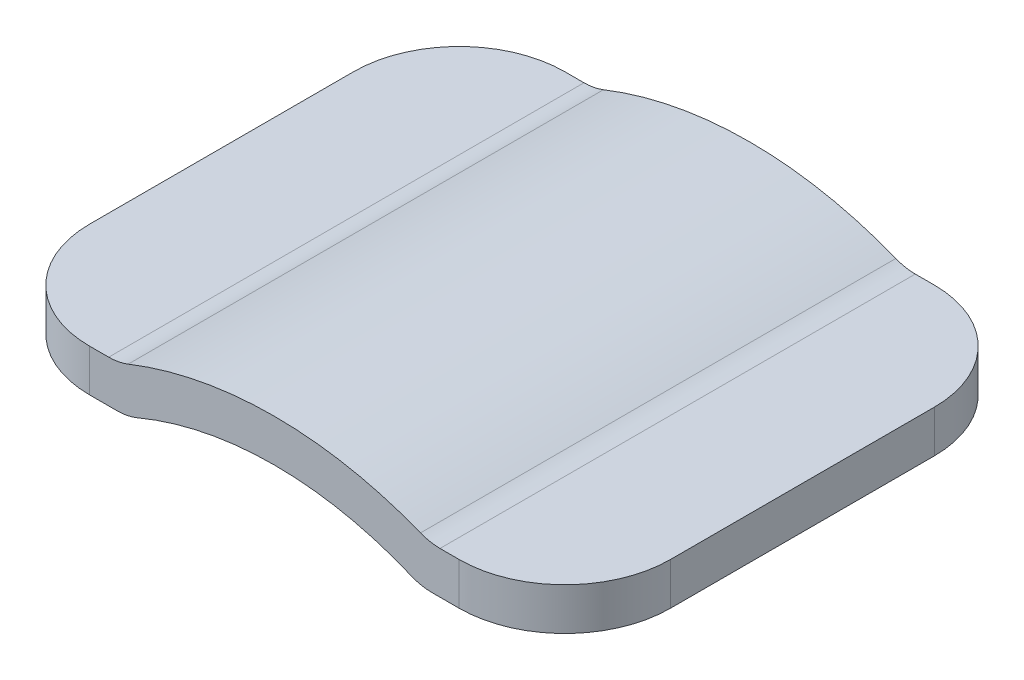
ISO-10303-21;
HEADER;
FILE_DESCRIPTION(('STEP AP214'),'2;1');
FILE_NAME('part.step','',(''),(''),'','','');
FILE_SCHEMA(('AUTOMOTIVE_DESIGN { 1 0 10303 214 1 1 1 1 }'));
ENDSEC;
DATA;
#1=APPLICATION_CONTEXT('core data for automotive mechanical design processes');
#2=APPLICATION_PROTOCOL_DEFINITION('international standard','automotive_design',2000,#1);
#3=PRODUCT_CONTEXT('',#1,'mechanical');
#4=PRODUCT('Part','Part','',(#3));
#5=PRODUCT_RELATED_PRODUCT_CATEGORY('part','',(#4));
#6=PRODUCT_DEFINITION_FORMATION('','',#4);
#7=PRODUCT_DEFINITION_CONTEXT('part definition',#1,'design');
#8=PRODUCT_DEFINITION('design','',#6,#7);
#9=PRODUCT_DEFINITION_SHAPE('','',#8);
#10=(LENGTH_UNIT() NAMED_UNIT(*) SI_UNIT(.MILLI.,.METRE.));
#11=(NAMED_UNIT(*) PLANE_ANGLE_UNIT() SI_UNIT($,.RADIAN.));
#12=(NAMED_UNIT(*) SI_UNIT($,.STERADIAN.) SOLID_ANGLE_UNIT());
#13=UNCERTAINTY_MEASURE_WITH_UNIT(LENGTH_MEASURE(1.E-05),#10,'distance_accuracy_value','');
#14=(GEOMETRIC_REPRESENTATION_CONTEXT(3) GLOBAL_UNCERTAINTY_ASSIGNED_CONTEXT((#13)) GLOBAL_UNIT_ASSIGNED_CONTEXT((#10,
#11,#12)) REPRESENTATION_CONTEXT('',''));
#15=CARTESIAN_POINT('',(0.,0.,0.));
#16=DIRECTION('',(0.,0.,1.));
#17=DIRECTION('',(1.,0.,0.));
#18=AXIS2_PLACEMENT_3D('',#15,#16,#17);
#19=CARTESIAN_POINT('',(-1100.,-120.,900.));
#20=DIRECTION('',(0.,1.,0.));
#21=DIRECTION('',(0.,0.,1.));
#22=AXIS2_PLACEMENT_3D('',#19,#20,#21);
#23=PLANE('',#22);
#24=CARTESIAN_POINT('',(-700.,-120.,-500.));
#25=DIRECTION('',(0.,1.,0.));
#26=DIRECTION('',(-1.,0.,0.));
#27=AXIS2_PLACEMENT_3D('',#24,#25,#26);
#28=CIRCLE('',#27,400.);
#29=CARTESIAN_POINT('',(-700.,-120.,-900.));
#30=VERTEX_POINT('',#29);
#31=CARTESIAN_POINT('',(-1100.,-120.,-500.));
#32=VERTEX_POINT('',#31);
#33=EDGE_CURVE('E149',#30,#32,#28,.T.);
#34=ORIENTED_EDGE('',*,*,#33,.F.);
#35=DIRECTION('',(1.,0.,0.));
#36=VECTOR('',#35,1.);
#37=CARTESIAN_POINT('',(-1100.,-120.,-900.));
#38=LINE('',#37,#36);
#39=CARTESIAN_POINT('',(-595.986577030053,-120.,-900.));
#40=VERTEX_POINT('',#39);
#41=EDGE_CURVE('E228',#30,#40,#38,.T.);
#42=ORIENTED_EDGE('',*,*,#41,.T.);
#43=DIRECTION('',(0.,0.,-1.));
#44=VECTOR('',#43,1.);
#45=CARTESIAN_POINT('',(-595.986577030053,-120.,900.));
#46=LINE('',#45,#44);
#47=CARTESIAN_POINT('',(-595.986577030053,-120.,900.));
#48=VERTEX_POINT('',#47);
#49=EDGE_CURVE('E12',#48,#40,#46,.T.);
#50=ORIENTED_EDGE('',*,*,#49,.F.);
#51=DIRECTION('',(1.,0.,0.));
#52=VECTOR('',#51,1.);
#53=CARTESIAN_POINT('',(-1100.,-120.,900.));
#54=LINE('',#53,#52);
#55=CARTESIAN_POINT('',(-700.,-120.,900.));
#56=VERTEX_POINT('',#55);
#57=EDGE_CURVE('E244',#56,#48,#54,.T.);
#58=ORIENTED_EDGE('',*,*,#57,.F.);
#59=CARTESIAN_POINT('',(-700.,-120.,500.));
#60=DIRECTION('',(0.,1.,0.));
#61=DIRECTION('',(-1.,0.,0.));
#62=AXIS2_PLACEMENT_3D('',#59,#60,#61);
#63=CIRCLE('',#62,400.);
#64=CARTESIAN_POINT('',(-1100.,-120.,500.));
#65=VERTEX_POINT('',#64);
#66=EDGE_CURVE('E60',#65,#56,#63,.T.);
#67=ORIENTED_EDGE('',*,*,#66,.F.);
#68=DIRECTION('',(0.,0.,-1.));
#69=VECTOR('',#68,1.);
#70=CARTESIAN_POINT('',(-1100.,-120.,900.));
#71=LINE('',#70,#69);
#72=EDGE_CURVE('E166',#65,#32,#71,.T.);
#73=ORIENTED_EDGE('',*,*,#72,.T.);
#74=EDGE_LOOP('',(#34,#42,#50,#58,#67,#73));
#75=FACE_BOUND('',#74,.T.);
#76=ADVANCED_FACE('F38',(#75),#23,.F.);
#77=CARTESIAN_POINT('',(1100.,-120.,900.));
#78=DIRECTION('',(0.,1.,0.));
#79=DIRECTION('',(-1.,0.,0.));
#80=AXIS2_PLACEMENT_3D('',#77,#78,#79);
#81=PLANE('',#80);
#82=CARTESIAN_POINT('',(700.,-120.,-500.));
#83=DIRECTION('',(0.,1.,0.));
#84=DIRECTION('',(1.,0.,0.));
#85=AXIS2_PLACEMENT_3D('',#82,#83,#84);
#86=CIRCLE('',#85,400.);
#87=CARTESIAN_POINT('',(1100.,-120.,-500.));
#88=VERTEX_POINT('',#87);
#89=CARTESIAN_POINT('',(700.,-120.,-900.));
#90=VERTEX_POINT('',#89);
#91=EDGE_CURVE('E170',#88,#90,#86,.T.);
#92=ORIENTED_EDGE('',*,*,#91,.F.);
#93=DIRECTION('',(0.,0.,-1.));
#94=VECTOR('',#93,1.);
#95=CARTESIAN_POINT('',(1100.,-120.,900.));
#96=LINE('',#95,#94);
#97=CARTESIAN_POINT('',(1100.,-120.,499.999999999999));
#98=VERTEX_POINT('',#97);
#99=EDGE_CURVE('E198',#98,#88,#96,.T.);
#100=ORIENTED_EDGE('',*,*,#99,.F.);
#101=CARTESIAN_POINT('',(700.,-120.,499.999999999999));
#102=DIRECTION('',(0.,1.,0.));
#103=DIRECTION('',(1.,0.,0.));
#104=AXIS2_PLACEMENT_3D('',#101,#102,#103);
#105=CIRCLE('',#104,400.);
#106=CARTESIAN_POINT('',(700.,-120.,899.999999999999));
#107=VERTEX_POINT('',#106);
#108=EDGE_CURVE('E312',#107,#98,#105,.T.);
#109=ORIENTED_EDGE('',*,*,#108,.F.);
#110=DIRECTION('',(1.,0.,0.));
#111=VECTOR('',#110,1.);
#112=CARTESIAN_POINT('',(1100.,-120.,900.));
#113=LINE('',#112,#111);
#114=CARTESIAN_POINT('',(595.986577030054,-120.,900.));
#115=VERTEX_POINT('',#114);
#116=EDGE_CURVE('E256',#115,#107,#113,.T.);
#117=ORIENTED_EDGE('',*,*,#116,.F.);
#118=DIRECTION('',(0.,0.,-1.));
#119=VECTOR('',#118,1.);
#120=CARTESIAN_POINT('',(595.986577030054,-120.,900.));
#121=LINE('',#120,#119);
#122=CARTESIAN_POINT('',(595.986577030054,-120.,-900.));
#123=VERTEX_POINT('',#122);
#124=EDGE_CURVE('E201',#115,#123,#121,.T.);
#125=ORIENTED_EDGE('',*,*,#124,.T.);
#126=DIRECTION('',(1.,0.,0.));
#127=VECTOR('',#126,1.);
#128=CARTESIAN_POINT('',(1100.,-120.,-900.));
#129=LINE('',#128,#127);
#130=EDGE_CURVE('E226',#123,#90,#129,.T.);
#131=ORIENTED_EDGE('',*,*,#130,.T.);
#132=EDGE_LOOP('',(#92,#100,#109,#117,#125,#131));
#133=FACE_BOUND('',#132,.T.);
#134=ADVANCED_FACE('F317',(#133),#81,.F.);
#135=CARTESIAN_POINT('',(1100.,-120.,900.));
#136=DIRECTION('',(-1.,0.,0.));
#137=DIRECTION('',(0.,0.,1.));
#138=AXIS2_PLACEMENT_3D('',#135,#136,#137);
#139=PLANE('',#138);
#140=ORIENTED_EDGE('',*,*,#99,.T.);
#141=DIRECTION('',(0.,1.,0.));
#142=VECTOR('',#141,1.);
#143=CARTESIAN_POINT('',(1100.,-120.,-500.));
#144=LINE('',#143,#142);
#145=CARTESIAN_POINT('',(1100.,39.9999999999998,-500.));
#146=VERTEX_POINT('',#145);
#147=EDGE_CURVE('E268',#88,#146,#144,.T.);
#148=ORIENTED_EDGE('',*,*,#147,.T.);
#149=DIRECTION('',(0.,0.,-1.));
#150=VECTOR('',#149,1.);
#151=CARTESIAN_POINT('',(1100.,40.0000000000002,900.));
#152=LINE('',#151,#150);
#153=CARTESIAN_POINT('',(1100.,39.9999999999998,499.999999999999));
#154=VERTEX_POINT('',#153);
#155=EDGE_CURVE('E195',#154,#146,#152,.T.);
#156=ORIENTED_EDGE('',*,*,#155,.F.);
#157=DIRECTION('',(0.,1.,0.));
#158=VECTOR('',#157,1.);
#159=CARTESIAN_POINT('',(1100.,-120.,499.999999999999));
#160=LINE('',#159,#158);
#161=EDGE_CURVE('E275',#98,#154,#160,.T.);
#162=ORIENTED_EDGE('',*,*,#161,.F.);
#163=EDGE_LOOP('',(#140,#148,#156,#162));
#164=FACE_BOUND('',#163,.T.);
#165=ADVANCED_FACE('F321',(#164),#139,.F.);
#166=CARTESIAN_POINT('',(1100.,40.0000000000002,900.));
#167=DIRECTION('',(0.,-1.,0.));
#168=DIRECTION('',(1.,0.,0.));
#169=AXIS2_PLACEMENT_3D('',#166,#167,#168);
#170=PLANE('',#169);
#171=CARTESIAN_POINT('',(700.,39.9999999999998,-500.));
#172=DIRECTION('',(0.,1.,0.));
#173=DIRECTION('',(1.,0.,0.));
#174=AXIS2_PLACEMENT_3D('',#171,#172,#173);
#175=CIRCLE('',#174,400.);
#176=CARTESIAN_POINT('',(700.,39.9999999999998,-900.));
#177=VERTEX_POINT('',#176);
#178=EDGE_CURVE('E159',#146,#177,#175,.T.);
#179=ORIENTED_EDGE('',*,*,#178,.T.);
#180=DIRECTION('',(-1.,0.,0.));
#181=VECTOR('',#180,1.);
#182=CARTESIAN_POINT('',(1100.,40.0000000000002,-900.));
#183=LINE('',#182,#181);
#184=CARTESIAN_POINT('',(627.375485654325,40.,-900.));
#185=VERTEX_POINT('',#184);
#186=EDGE_CURVE('E234',#177,#185,#183,.T.);
#187=ORIENTED_EDGE('',*,*,#186,.T.);
#188=DIRECTION('',(0.,0.,-1.));
#189=VECTOR('',#188,1.);
#190=CARTESIAN_POINT('',(627.375485654325,40.,900.));
#191=LINE('',#190,#189);
#192=CARTESIAN_POINT('',(627.375485654325,40.,900.));
#193=VERTEX_POINT('',#192);
#194=EDGE_CURVE('E192',#193,#185,#191,.T.);
#195=ORIENTED_EDGE('',*,*,#194,.F.);
#196=DIRECTION('',(-1.,0.,0.));
#197=VECTOR('',#196,1.);
#198=CARTESIAN_POINT('',(1100.,40.0000000000002,900.));
#199=LINE('',#198,#197);
#200=CARTESIAN_POINT('',(700.,40.0000000000001,900.));
#201=VERTEX_POINT('',#200);
#202=EDGE_CURVE('E259',#201,#193,#199,.T.);
#203=ORIENTED_EDGE('',*,*,#202,.F.);
#204=CARTESIAN_POINT('',(700.,39.9999999999998,499.999999999999));
#205=DIRECTION('',(0.,1.,0.));
#206=DIRECTION('',(1.,0.,0.));
#207=AXIS2_PLACEMENT_3D('',#204,#205,#206);
#208=CIRCLE('',#207,400.);
#209=EDGE_CURVE('E52',#201,#154,#208,.T.);
#210=ORIENTED_EDGE('',*,*,#209,.T.);
#211=ORIENTED_EDGE('',*,*,#155,.T.);
#212=EDGE_LOOP('',(#179,#187,#195,#203,#210,#211));
#213=FACE_BOUND('',#212,.T.);
#214=ADVANCED_FACE('F294',(#213),#170,.F.);
#215=CARTESIAN_POINT('',(-1100.,39.9999999999999,900.));
#216=DIRECTION('',(0.,-1.,0.));
#217=DIRECTION('',(1.,0.,0.));
#218=AXIS2_PLACEMENT_3D('',#215,#216,#217);
#219=PLANE('',#218);
#220=CARTESIAN_POINT('',(-700.,39.9999999999999,-500.));
#221=DIRECTION('',(0.,1.,0.));
#222=DIRECTION('',(-1.,0.,0.));
#223=AXIS2_PLACEMENT_3D('',#220,#221,#222);
#224=CIRCLE('',#223,400.);
#225=CARTESIAN_POINT('',(-700.,39.9999999999999,-900.));
#226=VERTEX_POINT('',#225);
#227=CARTESIAN_POINT('',(-1100.,39.9999999999999,-500.));
#228=VERTEX_POINT('',#227);
#229=EDGE_CURVE('E284',#226,#228,#224,.T.);
#230=ORIENTED_EDGE('',*,*,#229,.T.);
#231=DIRECTION('',(0.,0.,-1.));
#232=VECTOR('',#231,1.);
#233=CARTESIAN_POINT('',(-1100.,39.9999999999999,900.));
#234=LINE('',#233,#232);
#235=CARTESIAN_POINT('',(-1100.,39.9999999999999,500.));
#236=VERTEX_POINT('',#235);
#237=EDGE_CURVE('E168',#236,#228,#234,.T.);
#238=ORIENTED_EDGE('',*,*,#237,.F.);
#239=CARTESIAN_POINT('',(-700.,39.9999999999999,500.));
#240=DIRECTION('',(0.,1.,0.));
#241=DIRECTION('',(-1.,0.,0.));
#242=AXIS2_PLACEMENT_3D('',#239,#240,#241);
#243=CIRCLE('',#242,400.);
#244=CARTESIAN_POINT('',(-700.,39.9999999999999,900.));
#245=VERTEX_POINT('',#244);
#246=EDGE_CURVE('E283',#236,#245,#243,.T.);
#247=ORIENTED_EDGE('',*,*,#246,.T.);
#248=DIRECTION('',(-1.,0.,0.));
#249=VECTOR('',#248,1.);
#250=CARTESIAN_POINT('',(-1100.,39.9999999999999,900.));
#251=LINE('',#250,#249);
#252=CARTESIAN_POINT('',(-627.375485654325,39.9999999999999,900.));
#253=VERTEX_POINT('',#252);
#254=EDGE_CURVE('E173',#253,#245,#251,.T.);
#255=ORIENTED_EDGE('',*,*,#254,.F.);
#256=DIRECTION('',(0.,0.,-1.));
#257=VECTOR('',#256,1.);
#258=CARTESIAN_POINT('',(-627.375485654325,39.9999999999999,900.));
#259=LINE('',#258,#257);
#260=CARTESIAN_POINT('',(-627.375485654325,39.9999999999999,-900.));
#261=VERTEX_POINT('',#260);
#262=EDGE_CURVE('E175',#253,#261,#259,.T.);
#263=ORIENTED_EDGE('',*,*,#262,.T.);
#264=DIRECTION('',(-1.,0.,0.));
#265=VECTOR('',#264,1.);
#266=CARTESIAN_POINT('',(-1100.,39.9999999999999,-900.));
#267=LINE('',#266,#265);
#268=EDGE_CURVE('E181',#261,#226,#267,.T.);
#269=ORIENTED_EDGE('',*,*,#268,.T.);
#270=EDGE_LOOP('',(#230,#238,#247,#255,#263,#269));
#271=FACE_BOUND('',#270,.T.);
#272=ADVANCED_FACE('F281',(#271),#219,.F.);
#273=CARTESIAN_POINT('',(-1100.,-120.,900.));
#274=DIRECTION('',(1.,0.,0.));
#275=DIRECTION('',(0.,0.,-1.));
#276=AXIS2_PLACEMENT_3D('',#273,#274,#275);
#277=PLANE('',#276);
#278=DIRECTION('',(0.,1.,0.));
#279=VECTOR('',#278,1.);
#280=CARTESIAN_POINT('',(-1100.,-120.,-500.));
#281=LINE('',#280,#279);
#282=EDGE_CURVE('E152',#32,#228,#281,.T.);
#283=ORIENTED_EDGE('',*,*,#282,.F.);
#284=ORIENTED_EDGE('',*,*,#72,.F.);
#285=DIRECTION('',(0.,1.,0.));
#286=VECTOR('',#285,1.);
#287=CARTESIAN_POINT('',(-1100.,-120.,500.));
#288=LINE('',#287,#286);
#289=EDGE_CURVE('E169',#65,#236,#288,.T.);
#290=ORIENTED_EDGE('',*,*,#289,.T.);
#291=ORIENTED_EDGE('',*,*,#237,.T.);
#292=EDGE_LOOP('',(#283,#284,#290,#291));
#293=FACE_BOUND('',#292,.T.);
#294=ADVANCED_FACE('F164',(#293),#277,.F.);
#295=CARTESIAN_POINT('',(-595.986577030053,79.9999999999998,900.));
#296=DIRECTION('',(0.,0.,1.));
#297=DIRECTION('',(1.,0.,0.));
#298=AXIS2_PLACEMENT_3D('',#295,#296,#297);
#299=PLANE('',#298);
#300=CARTESIAN_POINT('',(-627.375485654325,240.,900.));
#301=DIRECTION('',(0.,0.,-1.));
#302=DIRECTION('',(1.,0.,0.));
#303=AXIS2_PLACEMENT_3D('',#300,#301,#302);
#304=CIRCLE('',#303,200.);
#305=CARTESIAN_POINT('',(-553.56660498911,54.1176470588235,900.));
#306=VERTEX_POINT('',#305);
#307=EDGE_CURVE('E178',#306,#253,#304,.T.);
#308=ORIENTED_EDGE('',*,*,#307,.T.);
#309=ORIENTED_EDGE('',*,*,#254,.T.);
#310=DIRECTION('',(0.,1.,0.));
#311=VECTOR('',#310,1.);
#312=CARTESIAN_POINT('',(-700.,-120.,900.));
#313=LINE('',#312,#311);
#314=EDGE_CURVE('E279',#56,#245,#313,.T.);
#315=ORIENTED_EDGE('',*,*,#314,.F.);
#316=ORIENTED_EDGE('',*,*,#57,.T.);
#317=CARTESIAN_POINT('',(-595.986577030053,79.9999999999998,900.));
#318=DIRECTION('',(0.,0.,1.));
#319=DIRECTION('',(1.,0.,0.));
#320=AXIS2_PLACEMENT_3D('',#317,#318,#319);
#321=CIRCLE('',#320,200.);
#322=CARTESIAN_POINT('',(-518.585722870306,-104.415584415585,900.));
#323=VERTEX_POINT('',#322);
#324=EDGE_CURVE('E247',#48,#323,#321,.T.);
#325=ORIENTED_EDGE('',*,*,#324,.T.);
#326=CARTESIAN_POINT('',(5.54888943684326E-13,-1340.,900.));
#327=DIRECTION('',(0.,0.,-1.));
#328=DIRECTION('',(-1.,0.,0.));
#329=AXIS2_PLACEMENT_3D('',#326,#327,#328);
#330=CIRCLE('',#329,1340.);
#331=CARTESIAN_POINT('',(518.585722870307,-104.415584415584,900.));
#332=VERTEX_POINT('',#331);
#333=EDGE_CURVE('E214',#323,#332,#330,.T.);
#334=ORIENTED_EDGE('',*,*,#333,.T.);
#335=CARTESIAN_POINT('',(595.986577030054,80.,900.));
#336=DIRECTION('',(0.,0.,1.));
#337=DIRECTION('',(-1.,0.,0.));
#338=AXIS2_PLACEMENT_3D('',#335,#336,#337);
#339=CIRCLE('',#338,200.);
#340=EDGE_CURVE('E254',#332,#115,#339,.T.);
#341=ORIENTED_EDGE('',*,*,#340,.T.);
#342=ORIENTED_EDGE('',*,*,#116,.T.);
#343=DIRECTION('',(0.,1.,0.));
#344=VECTOR('',#343,1.);
#345=CARTESIAN_POINT('',(700.,-120.,899.999999999999));
#346=LINE('',#345,#344);
#347=EDGE_CURVE('E277',#107,#201,#346,.T.);
#348=ORIENTED_EDGE('',*,*,#347,.T.);
#349=ORIENTED_EDGE('',*,*,#202,.T.);
#350=CARTESIAN_POINT('',(627.375485654325,240.,900.));
#351=DIRECTION('',(0.,0.,-1.));
#352=DIRECTION('',(-1.,0.,0.));
#353=AXIS2_PLACEMENT_3D('',#350,#351,#352);
#354=CIRCLE('',#353,200.);
#355=CARTESIAN_POINT('',(553.56660498911,54.1176470588236,900.));
#356=VERTEX_POINT('',#355);
#357=EDGE_CURVE('E261',#193,#356,#354,.T.);
#358=ORIENTED_EDGE('',*,*,#357,.T.);
#359=CARTESIAN_POINT('',(5.54888943684326E-13,-1340.,900.));
#360=DIRECTION('',(0.,0.,1.));
#361=DIRECTION('',(-1.,0.,0.));
#362=AXIS2_PLACEMENT_3D('',#359,#360,#361);
#363=CIRCLE('',#362,1500.);
#364=EDGE_CURVE('E263',#356,#306,#363,.T.);
#365=ORIENTED_EDGE('',*,*,#364,.T.);
#366=EDGE_LOOP('',(#308,#309,#315,#316,#325,#334,#341,#342,#348,#349,#358,#365));
#367=FACE_BOUND('',#366,.T.);
#368=ADVANCED_FACE('F308',(#367),#299,.T.);
#369=CARTESIAN_POINT('',(-595.986577030053,79.9999999999998,-900.));
#370=DIRECTION('',(0.,0.,1.));
#371=DIRECTION('',(1.,0.,0.));
#372=AXIS2_PLACEMENT_3D('',#369,#370,#371);
#373=PLANE('',#372);
#374=CARTESIAN_POINT('',(627.375485654325,240.,-900.));
#375=DIRECTION('',(0.,0.,-1.));
#376=DIRECTION('',(-1.,0.,0.));
#377=AXIS2_PLACEMENT_3D('',#374,#375,#376);
#378=CIRCLE('',#377,200.);
#379=CARTESIAN_POINT('',(553.56660498911,54.1176470588236,-900.));
#380=VERTEX_POINT('',#379);
#381=EDGE_CURVE('E236',#185,#380,#378,.T.);
#382=ORIENTED_EDGE('',*,*,#381,.F.);
#383=ORIENTED_EDGE('',*,*,#186,.F.);
#384=DIRECTION('',(0.,1.,0.));
#385=VECTOR('',#384,1.);
#386=CARTESIAN_POINT('',(700.,-120.,-900.));
#387=LINE('',#386,#385);
#388=EDGE_CURVE('E266',#90,#177,#387,.T.);
#389=ORIENTED_EDGE('',*,*,#388,.F.);
#390=ORIENTED_EDGE('',*,*,#130,.F.);
#391=CARTESIAN_POINT('',(595.986577030054,80.,-900.));
#392=DIRECTION('',(0.,0.,1.));
#393=DIRECTION('',(-1.,0.,0.));
#394=AXIS2_PLACEMENT_3D('',#391,#392,#393);
#395=CIRCLE('',#394,200.);
#396=CARTESIAN_POINT('',(518.585722870307,-104.415584415584,-900.));
#397=VERTEX_POINT('',#396);
#398=EDGE_CURVE('E224',#397,#123,#395,.T.);
#399=ORIENTED_EDGE('',*,*,#398,.F.);
#400=CARTESIAN_POINT('',(5.54888943684326E-13,-1340.,-900.));
#401=DIRECTION('',(0.,0.,-1.));
#402=DIRECTION('',(-1.,0.,0.));
#403=AXIS2_PLACEMENT_3D('',#400,#401,#402);
#404=CIRCLE('',#403,1340.);
#405=CARTESIAN_POINT('',(-518.585722870306,-104.415584415585,-900.));
#406=VERTEX_POINT('',#405);
#407=EDGE_CURVE('E213',#406,#397,#404,.T.);
#408=ORIENTED_EDGE('',*,*,#407,.F.);
#409=CARTESIAN_POINT('',(-595.986577030053,79.9999999999998,-900.));
#410=DIRECTION('',(0.,0.,1.));
#411=DIRECTION('',(1.,0.,0.));
#412=AXIS2_PLACEMENT_3D('',#409,#410,#411);
#413=CIRCLE('',#412,200.);
#414=EDGE_CURVE('E222',#40,#406,#413,.T.);
#415=ORIENTED_EDGE('',*,*,#414,.F.);
#416=ORIENTED_EDGE('',*,*,#41,.F.);
#417=DIRECTION('',(0.,1.,0.));
#418=VECTOR('',#417,1.);
#419=CARTESIAN_POINT('',(-700.,-120.,-900.));
#420=LINE('',#419,#418);
#421=EDGE_CURVE('E155',#30,#226,#420,.T.);
#422=ORIENTED_EDGE('',*,*,#421,.T.);
#423=ORIENTED_EDGE('',*,*,#268,.F.);
#424=CARTESIAN_POINT('',(-627.375485654325,240.,-900.));
#425=DIRECTION('',(0.,0.,-1.));
#426=DIRECTION('',(1.,0.,0.));
#427=AXIS2_PLACEMENT_3D('',#424,#425,#426);
#428=CIRCLE('',#427,200.);
#429=CARTESIAN_POINT('',(-553.56660498911,54.1176470588235,-900.));
#430=VERTEX_POINT('',#429);
#431=EDGE_CURVE('E239',#430,#261,#428,.T.);
#432=ORIENTED_EDGE('',*,*,#431,.F.);
#433=CARTESIAN_POINT('',(5.54888943684326E-13,-1340.,-900.));
#434=DIRECTION('',(0.,0.,1.));
#435=DIRECTION('',(-1.,0.,0.));
#436=AXIS2_PLACEMENT_3D('',#433,#434,#435);
#437=CIRCLE('',#436,1500.);
#438=EDGE_CURVE('E238',#380,#430,#437,.T.);
#439=ORIENTED_EDGE('',*,*,#438,.F.);
#440=EDGE_LOOP('',(#382,#383,#389,#390,#399,#408,#415,#416,#422,#423,#432,#439));
#441=FACE_BOUND('',#440,.T.);
#442=ADVANCED_FACE('F221',(#441),#373,.F.);
#443=CARTESIAN_POINT('',(-595.986577030053,79.9999999999998,900.));
#444=DIRECTION('',(0.,0.,-1.));
#445=DIRECTION('',(-1.,0.,0.));
#446=AXIS2_PLACEMENT_3D('',#443,#444,#445);
#447=CYLINDRICAL_SURFACE('',#446,200.);
#448=ORIENTED_EDGE('',*,*,#414,.T.);
#449=DIRECTION('',(0.,0.,-1.));
#450=VECTOR('',#449,1.);
#451=CARTESIAN_POINT('',(-518.585722870306,-104.415584415585,900.));
#452=LINE('',#451,#450);
#453=EDGE_CURVE('E45',#323,#406,#452,.T.);
#454=ORIENTED_EDGE('',*,*,#453,.F.);
#455=ORIENTED_EDGE('',*,*,#324,.F.);
#456=ORIENTED_EDGE('',*,*,#49,.T.);
#457=EDGE_LOOP('',(#448,#454,#455,#456));
#458=FACE_BOUND('',#457,.T.);
#459=ADVANCED_FACE('F384',(#458),#447,.T.);
#460=CARTESIAN_POINT('',(5.54888943684326E-13,-1340.,900.));
#461=DIRECTION('',(0.,0.,-1.));
#462=DIRECTION('',(-1.,0.,0.));
#463=AXIS2_PLACEMENT_3D('',#460,#461,#462);
#464=CYLINDRICAL_SURFACE('',#463,1340.);
#465=ORIENTED_EDGE('',*,*,#407,.T.);
#466=DIRECTION('',(0.,0.,-1.));
#467=VECTOR('',#466,1.);
#468=CARTESIAN_POINT('',(518.585722870307,-104.415584415584,900.));
#469=LINE('',#468,#467);
#470=EDGE_CURVE('E204',#332,#397,#469,.T.);
#471=ORIENTED_EDGE('',*,*,#470,.F.);
#472=ORIENTED_EDGE('',*,*,#333,.F.);
#473=ORIENTED_EDGE('',*,*,#453,.T.);
#474=EDGE_LOOP('',(#465,#471,#472,#473));
#475=FACE_BOUND('',#474,.T.);
#476=ADVANCED_FACE('F211',(#475),#464,.F.);
#477=CARTESIAN_POINT('',(595.986577030054,80.,900.));
#478=DIRECTION('',(0.,0.,-1.));
#479=DIRECTION('',(-1.,0.,0.));
#480=AXIS2_PLACEMENT_3D('',#477,#478,#479);
#481=CYLINDRICAL_SURFACE('',#480,200.);
#482=ORIENTED_EDGE('',*,*,#398,.T.);
#483=ORIENTED_EDGE('',*,*,#124,.F.);
#484=ORIENTED_EDGE('',*,*,#340,.F.);
#485=ORIENTED_EDGE('',*,*,#470,.T.);
#486=EDGE_LOOP('',(#482,#483,#484,#485));
#487=FACE_BOUND('',#486,.T.);
#488=ADVANCED_FACE('F443',(#487),#481,.T.);
#489=CARTESIAN_POINT('',(627.375485654325,240.,900.));
#490=DIRECTION('',(0.,0.,-1.));
#491=DIRECTION('',(-1.,0.,0.));
#492=AXIS2_PLACEMENT_3D('',#489,#490,#491);
#493=CYLINDRICAL_SURFACE('',#492,200.);
#494=ORIENTED_EDGE('',*,*,#381,.T.);
#495=DIRECTION('',(0.,0.,-1.));
#496=VECTOR('',#495,1.);
#497=CARTESIAN_POINT('',(553.56660498911,54.1176470588236,900.));
#498=LINE('',#497,#496);
#499=EDGE_CURVE('E189',#356,#380,#498,.T.);
#500=ORIENTED_EDGE('',*,*,#499,.F.);
#501=ORIENTED_EDGE('',*,*,#357,.F.);
#502=ORIENTED_EDGE('',*,*,#194,.T.);
#503=EDGE_LOOP('',(#494,#500,#501,#502));
#504=FACE_BOUND('',#503,.T.);
#505=ADVANCED_FACE('F301',(#504),#493,.F.);
#506=CARTESIAN_POINT('',(5.54888943684326E-13,-1340.,900.));
#507=DIRECTION('',(0.,0.,-1.));
#508=DIRECTION('',(-1.,0.,0.));
#509=AXIS2_PLACEMENT_3D('',#506,#507,#508);
#510=CYLINDRICAL_SURFACE('',#509,1500.);
#511=ORIENTED_EDGE('',*,*,#438,.T.);
#512=DIRECTION('',(0.,0.,-1.));
#513=VECTOR('',#512,1.);
#514=CARTESIAN_POINT('',(-553.56660498911,54.1176470588235,900.));
#515=LINE('',#514,#513);
#516=EDGE_CURVE('E186',#306,#430,#515,.T.);
#517=ORIENTED_EDGE('',*,*,#516,.F.);
#518=ORIENTED_EDGE('',*,*,#364,.F.);
#519=ORIENTED_EDGE('',*,*,#499,.T.);
#520=EDGE_LOOP('',(#511,#517,#518,#519));
#521=FACE_BOUND('',#520,.T.);
#522=ADVANCED_FACE('F305',(#521),#510,.T.);
#523=CARTESIAN_POINT('',(-627.375485654325,240.,900.));
#524=DIRECTION('',(0.,0.,-1.));
#525=DIRECTION('',(-1.,0.,0.));
#526=AXIS2_PLACEMENT_3D('',#523,#524,#525);
#527=CYLINDRICAL_SURFACE('',#526,200.);
#528=ORIENTED_EDGE('',*,*,#431,.T.);
#529=ORIENTED_EDGE('',*,*,#262,.F.);
#530=ORIENTED_EDGE('',*,*,#307,.F.);
#531=ORIENTED_EDGE('',*,*,#516,.T.);
#532=EDGE_LOOP('',(#528,#529,#530,#531));
#533=FACE_BOUND('',#532,.T.);
#534=ADVANCED_FACE('F395',(#533),#527,.F.);
#535=CARTESIAN_POINT('',(700.,-120.,-500.));
#536=DIRECTION('',(0.,1.,0.));
#537=DIRECTION('',(-1.,0.,0.));
#538=AXIS2_PLACEMENT_3D('',#535,#536,#537);
#539=CYLINDRICAL_SURFACE('',#538,400.);
#540=ORIENTED_EDGE('',*,*,#178,.F.);
#541=ORIENTED_EDGE('',*,*,#147,.F.);
#542=ORIENTED_EDGE('',*,*,#91,.T.);
#543=ORIENTED_EDGE('',*,*,#388,.T.);
#544=EDGE_LOOP('',(#540,#541,#542,#543));
#545=FACE_BOUND('',#544,.T.);
#546=ADVANCED_FACE('F319',(#545),#539,.T.);
#547=CARTESIAN_POINT('',(-700.,-120.,-500.));
#548=DIRECTION('',(0.,1.,0.));
#549=DIRECTION('',(-1.,0.,0.));
#550=AXIS2_PLACEMENT_3D('',#547,#548,#549);
#551=CYLINDRICAL_SURFACE('',#550,400.);
#552=ORIENTED_EDGE('',*,*,#229,.F.);
#553=ORIENTED_EDGE('',*,*,#421,.F.);
#554=ORIENTED_EDGE('',*,*,#33,.T.);
#555=ORIENTED_EDGE('',*,*,#282,.T.);
#556=EDGE_LOOP('',(#552,#553,#554,#555));
#557=FACE_BOUND('',#556,.T.);
#558=ADVANCED_FACE('F151',(#557),#551,.T.);
#559=CARTESIAN_POINT('',(-700.,-120.,500.));
#560=DIRECTION('',(0.,1.,0.));
#561=DIRECTION('',(-1.,0.,0.));
#562=AXIS2_PLACEMENT_3D('',#559,#560,#561);
#563=CYLINDRICAL_SURFACE('',#562,400.);
#564=ORIENTED_EDGE('',*,*,#246,.F.);
#565=ORIENTED_EDGE('',*,*,#289,.F.);
#566=ORIENTED_EDGE('',*,*,#66,.T.);
#567=ORIENTED_EDGE('',*,*,#314,.T.);
#568=EDGE_LOOP('',(#564,#565,#566,#567));
#569=FACE_BOUND('',#568,.T.);
#570=ADVANCED_FACE('F406',(#569),#563,.T.);
#571=CARTESIAN_POINT('',(700.,-120.,499.999999999999));
#572=DIRECTION('',(0.,1.,0.));
#573=DIRECTION('',(-1.,0.,0.));
#574=AXIS2_PLACEMENT_3D('',#571,#572,#573);
#575=CYLINDRICAL_SURFACE('',#574,400.);
#576=ORIENTED_EDGE('',*,*,#209,.F.);
#577=ORIENTED_EDGE('',*,*,#347,.F.);
#578=ORIENTED_EDGE('',*,*,#108,.T.);
#579=ORIENTED_EDGE('',*,*,#161,.T.);
#580=EDGE_LOOP('',(#576,#577,#578,#579));
#581=FACE_BOUND('',#580,.T.);
#582=ADVANCED_FACE('F311',(#581),#575,.T.);
#583=CLOSED_SHELL('',(#76,#134,#165,#214,#272,#294,#368,#442,#459,#476,#488,#505,#522,#534,#546,
#558,#570,#582));
#584=MANIFOLD_SOLID_BREP('B2',#583);
#585=ADVANCED_BREP_SHAPE_REPRESENTATION('',(#18,#584),#14);
#586=SHAPE_DEFINITION_REPRESENTATION(#9,#585);
ENDSEC;
END-ISO-10303-21;
